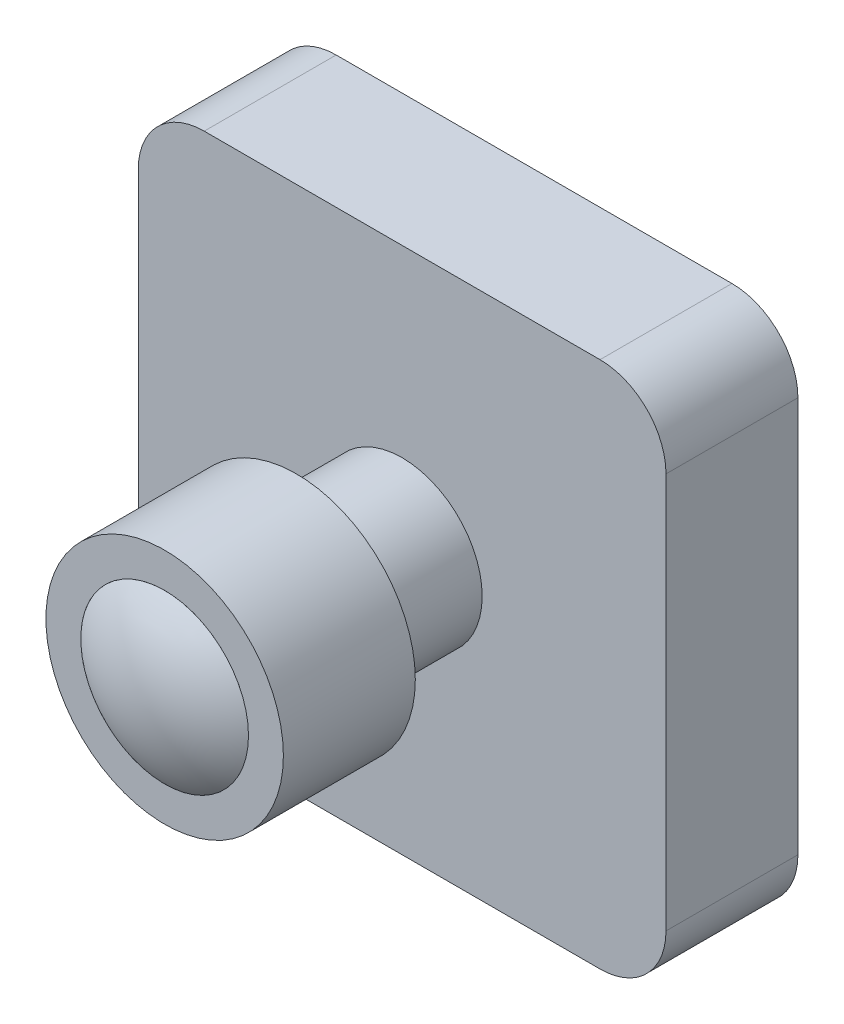
ISO-10303-21;
HEADER;
FILE_DESCRIPTION(('STEP AP214'),'2;1');
FILE_NAME('part.step','',(''),(''),'','','');
FILE_SCHEMA(('AUTOMOTIVE_DESIGN { 1 0 10303 214 1 1 1 1 }'));
ENDSEC;
DATA;
#1=APPLICATION_CONTEXT('core data for automotive mechanical design processes');
#2=APPLICATION_PROTOCOL_DEFINITION('international standard','automotive_design',2000,#1);
#3=PRODUCT_CONTEXT('',#1,'mechanical');
#4=PRODUCT('Part','Part','',(#3));
#5=PRODUCT_RELATED_PRODUCT_CATEGORY('part','',(#4));
#6=PRODUCT_DEFINITION_FORMATION('','',#4);
#7=PRODUCT_DEFINITION_CONTEXT('part definition',#1,'design');
#8=PRODUCT_DEFINITION('design','',#6,#7);
#9=PRODUCT_DEFINITION_SHAPE('','',#8);
#10=(LENGTH_UNIT() NAMED_UNIT(*) SI_UNIT(.MILLI.,.METRE.));
#11=(NAMED_UNIT(*) PLANE_ANGLE_UNIT() SI_UNIT($,.RADIAN.));
#12=(NAMED_UNIT(*) SI_UNIT($,.STERADIAN.) SOLID_ANGLE_UNIT());
#13=UNCERTAINTY_MEASURE_WITH_UNIT(LENGTH_MEASURE(1.E-05),#10,'distance_accuracy_value','');
#14=(GEOMETRIC_REPRESENTATION_CONTEXT(3) GLOBAL_UNCERTAINTY_ASSIGNED_CONTEXT((#13)) GLOBAL_UNIT_ASSIGNED_CONTEXT((#10,
#11,#12)) REPRESENTATION_CONTEXT('',''));
#15=CARTESIAN_POINT('',(0.,0.,0.));
#16=DIRECTION('',(0.,0.,1.));
#17=DIRECTION('',(1.,0.,0.));
#18=AXIS2_PLACEMENT_3D('',#15,#16,#17);
#19=CARTESIAN_POINT('',(0.,0.,1.32776193960538));
#20=DIRECTION('',(0.,0.,1.));
#21=DIRECTION('',(1.,0.,0.));
#22=AXIS2_PLACEMENT_3D('',#19,#20,#21);
#23=SPHERICAL_SURFACE('',#22,10.7514344350373);
#24=CARTESIAN_POINT('',(0.,0.,10.));
#25=DIRECTION('',(0.,0.,1.));
#26=DIRECTION('',(1.,0.,0.));
#27=AXIS2_PLACEMENT_3D('',#24,#25,#26);
#28=CIRCLE('',#27,6.35496887755949);
#29=CARTESIAN_POINT('',(6.35496887755949,0.,10.));
#30=VERTEX_POINT('',#29);
#31=EDGE_CURVE('E11',#30,#30,#28,.T.);
#32=ORIENTED_EDGE('',*,*,#31,.T.);
#33=EDGE_LOOP('',(#32));
#34=FACE_BOUND('',#33,.T.);
#35=ADVANCED_FACE('F46',(#34),#23,.T.);
#36=OPEN_SHELL('',(#35));
#37=SHELL_BASED_SURFACE_MODEL('B2',(#36));
#38=CARTESIAN_POINT('',(-15.,-15.,-18.));
#39=DIRECTION('',(0.,0.,1.));
#40=DIRECTION('',(1.,0.,0.));
#41=AXIS2_PLACEMENT_3D('',#38,#39,#40);
#42=CYLINDRICAL_SURFACE('',#41,5.);
#43=CARTESIAN_POINT('',(-15.,-15.,-8.));
#44=DIRECTION('',(0.,0.,-1.));
#45=DIRECTION('',(1.,0.,0.));
#46=AXIS2_PLACEMENT_3D('',#43,#44,#45);
#47=CIRCLE('',#46,5.);
#48=CARTESIAN_POINT('',(-15.,-20.,-8.));
#49=VERTEX_POINT('',#48);
#50=CARTESIAN_POINT('',(-20.,-15.,-8.));
#51=VERTEX_POINT('',#50);
#52=EDGE_CURVE('E166',#49,#51,#47,.T.);
#53=ORIENTED_EDGE('',*,*,#52,.T.);
#54=DIRECTION('',(0.,0.,1.));
#55=VECTOR('',#54,1.);
#56=CARTESIAN_POINT('',(-20.,-15.,-18.));
#57=LINE('',#56,#55);
#58=CARTESIAN_POINT('',(-20.,-15.,-18.));
#59=VERTEX_POINT('',#58);
#60=EDGE_CURVE('E44',#59,#51,#57,.T.);
#61=ORIENTED_EDGE('',*,*,#60,.F.);
#62=CARTESIAN_POINT('',(-15.,-15.,-18.));
#63=DIRECTION('',(0.,0.,-1.));
#64=DIRECTION('',(1.,0.,0.));
#65=AXIS2_PLACEMENT_3D('',#62,#63,#64);
#66=CIRCLE('',#65,5.);
#67=CARTESIAN_POINT('',(-15.,-20.,-18.));
#68=VERTEX_POINT('',#67);
#69=EDGE_CURVE('E180',#68,#59,#66,.T.);
#70=ORIENTED_EDGE('',*,*,#69,.F.);
#71=DIRECTION('',(0.,0.,1.));
#72=VECTOR('',#71,1.);
#73=CARTESIAN_POINT('',(-15.,-20.,-18.));
#74=LINE('',#73,#72);
#75=EDGE_CURVE('E162',#68,#49,#74,.T.);
#76=ORIENTED_EDGE('',*,*,#75,.T.);
#77=EDGE_LOOP('',(#53,#61,#70,#76));
#78=FACE_BOUND('',#77,.T.);
#79=ADVANCED_FACE('F70',(#78),#42,.T.);
#80=CARTESIAN_POINT('',(-20.,-15.,-18.));
#81=DIRECTION('',(1.,0.,0.));
#82=DIRECTION('',(0.,0.,-1.));
#83=AXIS2_PLACEMENT_3D('',#80,#81,#82);
#84=PLANE('',#83);
#85=DIRECTION('',(0.,1.,0.));
#86=VECTOR('',#85,1.);
#87=CARTESIAN_POINT('',(-20.,-15.,-8.));
#88=LINE('',#87,#86);
#89=CARTESIAN_POINT('',(-20.,15.,-8.));
#90=VERTEX_POINT('',#89);
#91=EDGE_CURVE('E169',#51,#90,#88,.T.);
#92=ORIENTED_EDGE('',*,*,#91,.T.);
#93=DIRECTION('',(0.,0.,1.));
#94=VECTOR('',#93,1.);
#95=CARTESIAN_POINT('',(-20.,15.,-18.));
#96=LINE('',#95,#94);
#97=CARTESIAN_POINT('',(-20.,15.,-18.));
#98=VERTEX_POINT('',#97);
#99=EDGE_CURVE('E78',#98,#90,#96,.T.);
#100=ORIENTED_EDGE('',*,*,#99,.F.);
#101=DIRECTION('',(0.,1.,0.));
#102=VECTOR('',#101,1.);
#103=CARTESIAN_POINT('',(-20.,-15.,-18.));
#104=LINE('',#103,#102);
#105=EDGE_CURVE('E129',#59,#98,#104,.T.);
#106=ORIENTED_EDGE('',*,*,#105,.F.);
#107=ORIENTED_EDGE('',*,*,#60,.T.);
#108=EDGE_LOOP('',(#92,#100,#106,#107));
#109=FACE_BOUND('',#108,.T.);
#110=ADVANCED_FACE('F215',(#109),#84,.F.);
#111=CARTESIAN_POINT('',(-15.,15.,-18.));
#112=DIRECTION('',(0.,0.,1.));
#113=DIRECTION('',(1.,0.,0.));
#114=AXIS2_PLACEMENT_3D('',#111,#112,#113);
#115=CYLINDRICAL_SURFACE('',#114,5.);
#116=CARTESIAN_POINT('',(-15.,15.,-8.));
#117=DIRECTION('',(0.,0.,-1.));
#118=DIRECTION('',(1.,0.,0.));
#119=AXIS2_PLACEMENT_3D('',#116,#117,#118);
#120=CIRCLE('',#119,5.);
#121=CARTESIAN_POINT('',(-15.,20.,-8.));
#122=VERTEX_POINT('',#121);
#123=EDGE_CURVE('E171',#90,#122,#120,.T.);
#124=ORIENTED_EDGE('',*,*,#123,.T.);
#125=DIRECTION('',(0.,0.,1.));
#126=VECTOR('',#125,1.);
#127=CARTESIAN_POINT('',(-15.,20.,-18.));
#128=LINE('',#127,#126);
#129=CARTESIAN_POINT('',(-15.,20.,-18.));
#130=VERTEX_POINT('',#129);
#131=EDGE_CURVE('E187',#130,#122,#128,.T.);
#132=ORIENTED_EDGE('',*,*,#131,.F.);
#133=CARTESIAN_POINT('',(-15.,15.,-18.));
#134=DIRECTION('',(0.,0.,-1.));
#135=DIRECTION('',(1.,0.,0.));
#136=AXIS2_PLACEMENT_3D('',#133,#134,#135);
#137=CIRCLE('',#136,5.);
#138=EDGE_CURVE('E195',#98,#130,#137,.T.);
#139=ORIENTED_EDGE('',*,*,#138,.F.);
#140=ORIENTED_EDGE('',*,*,#99,.T.);
#141=EDGE_LOOP('',(#124,#132,#139,#140));
#142=FACE_BOUND('',#141,.T.);
#143=ADVANCED_FACE('F193',(#142),#115,.T.);
#144=CARTESIAN_POINT('',(15.,20.,-18.));
#145=DIRECTION('',(0.,-1.,0.));
#146=DIRECTION('',(0.,0.,-1.));
#147=AXIS2_PLACEMENT_3D('',#144,#145,#146);
#148=PLANE('',#147);
#149=DIRECTION('',(1.,0.,0.));
#150=VECTOR('',#149,1.);
#151=CARTESIAN_POINT('',(15.,20.,-8.));
#152=LINE('',#151,#150);
#153=CARTESIAN_POINT('',(15.,20.,-8.));
#154=VERTEX_POINT('',#153);
#155=EDGE_CURVE('E173',#122,#154,#152,.T.);
#156=ORIENTED_EDGE('',*,*,#155,.T.);
#157=DIRECTION('',(0.,0.,1.));
#158=VECTOR('',#157,1.);
#159=CARTESIAN_POINT('',(15.,20.,-18.));
#160=LINE('',#159,#158);
#161=CARTESIAN_POINT('',(15.,20.,-18.));
#162=VERTEX_POINT('',#161);
#163=EDGE_CURVE('E184',#162,#154,#160,.T.);
#164=ORIENTED_EDGE('',*,*,#163,.F.);
#165=DIRECTION('',(1.,0.,0.));
#166=VECTOR('',#165,1.);
#167=CARTESIAN_POINT('',(15.,20.,-18.));
#168=LINE('',#167,#166);
#169=EDGE_CURVE('E207',#130,#162,#168,.T.);
#170=ORIENTED_EDGE('',*,*,#169,.F.);
#171=ORIENTED_EDGE('',*,*,#131,.T.);
#172=EDGE_LOOP('',(#156,#164,#170,#171));
#173=FACE_BOUND('',#172,.T.);
#174=ADVANCED_FACE('F203',(#173),#148,.F.);
#175=CARTESIAN_POINT('',(15.,15.,-18.));
#176=DIRECTION('',(0.,0.,1.));
#177=DIRECTION('',(1.,0.,0.));
#178=AXIS2_PLACEMENT_3D('',#175,#176,#177);
#179=CYLINDRICAL_SURFACE('',#178,5.);
#180=CARTESIAN_POINT('',(15.,15.,-8.));
#181=DIRECTION('',(0.,0.,-1.));
#182=DIRECTION('',(1.,0.,0.));
#183=AXIS2_PLACEMENT_3D('',#180,#181,#182);
#184=CIRCLE('',#183,5.);
#185=CARTESIAN_POINT('',(20.,15.,-8.));
#186=VERTEX_POINT('',#185);
#187=EDGE_CURVE('E175',#154,#186,#184,.T.);
#188=ORIENTED_EDGE('',*,*,#187,.T.);
#189=DIRECTION('',(0.,0.,1.));
#190=VECTOR('',#189,1.);
#191=CARTESIAN_POINT('',(20.,15.,-18.));
#192=LINE('',#191,#190);
#193=CARTESIAN_POINT('',(20.,15.,-18.));
#194=VERTEX_POINT('',#193);
#195=EDGE_CURVE('E157',#194,#186,#192,.T.);
#196=ORIENTED_EDGE('',*,*,#195,.F.);
#197=CARTESIAN_POINT('',(15.,15.,-18.));
#198=DIRECTION('',(0.,0.,-1.));
#199=DIRECTION('',(1.,0.,0.));
#200=AXIS2_PLACEMENT_3D('',#197,#198,#199);
#201=CIRCLE('',#200,5.);
#202=EDGE_CURVE('E148',#162,#194,#201,.T.);
#203=ORIENTED_EDGE('',*,*,#202,.F.);
#204=ORIENTED_EDGE('',*,*,#163,.T.);
#205=EDGE_LOOP('',(#188,#196,#203,#204));
#206=FACE_BOUND('',#205,.T.);
#207=ADVANCED_FACE('F206',(#206),#179,.T.);
#208=CARTESIAN_POINT('',(20.,-15.,-18.));
#209=DIRECTION('',(-1.,0.,0.));
#210=DIRECTION('',(0.,0.,1.));
#211=AXIS2_PLACEMENT_3D('',#208,#209,#210);
#212=PLANE('',#211);
#213=DIRECTION('',(0.,-1.,0.));
#214=VECTOR('',#213,1.);
#215=CARTESIAN_POINT('',(20.,-15.,-8.));
#216=LINE('',#215,#214);
#217=CARTESIAN_POINT('',(20.,-15.,-8.));
#218=VERTEX_POINT('',#217);
#219=EDGE_CURVE('E156',#186,#218,#216,.T.);
#220=ORIENTED_EDGE('',*,*,#219,.T.);
#221=DIRECTION('',(0.,0.,1.));
#222=VECTOR('',#221,1.);
#223=CARTESIAN_POINT('',(20.,-15.,-18.));
#224=LINE('',#223,#222);
#225=CARTESIAN_POINT('',(20.,-15.,-18.));
#226=VERTEX_POINT('',#225);
#227=EDGE_CURVE('E153',#226,#218,#224,.T.);
#228=ORIENTED_EDGE('',*,*,#227,.F.);
#229=DIRECTION('',(0.,-1.,0.));
#230=VECTOR('',#229,1.);
#231=CARTESIAN_POINT('',(20.,-15.,-18.));
#232=LINE('',#231,#230);
#233=EDGE_CURVE('E142',#194,#226,#232,.T.);
#234=ORIENTED_EDGE('',*,*,#233,.F.);
#235=ORIENTED_EDGE('',*,*,#195,.T.);
#236=EDGE_LOOP('',(#220,#228,#234,#235));
#237=FACE_BOUND('',#236,.T.);
#238=ADVANCED_FACE('F154',(#237),#212,.F.);
#239=CARTESIAN_POINT('',(15.,-15.,-18.));
#240=DIRECTION('',(0.,0.,1.));
#241=DIRECTION('',(1.,0.,0.));
#242=AXIS2_PLACEMENT_3D('',#239,#240,#241);
#243=CYLINDRICAL_SURFACE('',#242,5.);
#244=CARTESIAN_POINT('',(15.,-15.,-8.));
#245=DIRECTION('',(0.,0.,-1.));
#246=DIRECTION('',(1.,0.,0.));
#247=AXIS2_PLACEMENT_3D('',#244,#245,#246);
#248=CIRCLE('',#247,5.);
#249=CARTESIAN_POINT('',(15.,-20.,-8.));
#250=VERTEX_POINT('',#249);
#251=EDGE_CURVE('E115',#218,#250,#248,.T.);
#252=ORIENTED_EDGE('',*,*,#251,.T.);
#253=DIRECTION('',(0.,0.,1.));
#254=VECTOR('',#253,1.);
#255=CARTESIAN_POINT('',(15.,-20.,-18.));
#256=LINE('',#255,#254);
#257=CARTESIAN_POINT('',(15.,-20.,-18.));
#258=VERTEX_POINT('',#257);
#259=EDGE_CURVE('E158',#258,#250,#256,.T.);
#260=ORIENTED_EDGE('',*,*,#259,.F.);
#261=CARTESIAN_POINT('',(15.,-15.,-18.));
#262=DIRECTION('',(0.,0.,-1.));
#263=DIRECTION('',(1.,0.,0.));
#264=AXIS2_PLACEMENT_3D('',#261,#262,#263);
#265=CIRCLE('',#264,5.);
#266=EDGE_CURVE('E146',#226,#258,#265,.T.);
#267=ORIENTED_EDGE('',*,*,#266,.F.);
#268=ORIENTED_EDGE('',*,*,#227,.T.);
#269=EDGE_LOOP('',(#252,#260,#267,#268));
#270=FACE_BOUND('',#269,.T.);
#271=ADVANCED_FACE('F160',(#270),#243,.T.);
#272=CARTESIAN_POINT('',(15.,-20.,-18.));
#273=DIRECTION('',(0.,1.,0.));
#274=DIRECTION('',(0.,0.,1.));
#275=AXIS2_PLACEMENT_3D('',#272,#273,#274);
#276=PLANE('',#275);
#277=DIRECTION('',(-1.,0.,0.));
#278=VECTOR('',#277,1.);
#279=CARTESIAN_POINT('',(15.,-20.,-8.));
#280=LINE('',#279,#278);
#281=EDGE_CURVE('E121',#250,#49,#280,.T.);
#282=ORIENTED_EDGE('',*,*,#281,.T.);
#283=ORIENTED_EDGE('',*,*,#75,.F.);
#284=DIRECTION('',(-1.,0.,0.));
#285=VECTOR('',#284,1.);
#286=CARTESIAN_POINT('',(15.,-20.,-18.));
#287=LINE('',#286,#285);
#288=EDGE_CURVE('E86',#258,#68,#287,.T.);
#289=ORIENTED_EDGE('',*,*,#288,.F.);
#290=ORIENTED_EDGE('',*,*,#259,.T.);
#291=EDGE_LOOP('',(#282,#283,#289,#290));
#292=FACE_BOUND('',#291,.T.);
#293=ADVANCED_FACE('F231',(#292),#276,.F.);
#294=CARTESIAN_POINT('',(-15.,-15.,-18.));
#295=DIRECTION('',(0.,0.,1.));
#296=DIRECTION('',(1.,0.,0.));
#297=AXIS2_PLACEMENT_3D('',#294,#295,#296);
#298=PLANE('',#297);
#299=ORIENTED_EDGE('',*,*,#69,.T.);
#300=ORIENTED_EDGE('',*,*,#105,.T.);
#301=ORIENTED_EDGE('',*,*,#138,.T.);
#302=ORIENTED_EDGE('',*,*,#169,.T.);
#303=ORIENTED_EDGE('',*,*,#202,.T.);
#304=ORIENTED_EDGE('',*,*,#233,.T.);
#305=ORIENTED_EDGE('',*,*,#266,.T.);
#306=ORIENTED_EDGE('',*,*,#288,.T.);
#307=EDGE_LOOP('',(#299,#300,#301,#302,#303,#304,#305,#306));
#308=FACE_BOUND('',#307,.T.);
#309=ADVANCED_FACE('F144',(#308),#298,.F.);
#310=CARTESIAN_POINT('',(-15.,-15.,-8.));
#311=DIRECTION('',(0.,0.,1.));
#312=DIRECTION('',(1.,0.,0.));
#313=AXIS2_PLACEMENT_3D('',#310,#311,#312);
#314=PLANE('',#313);
#315=ORIENTED_EDGE('',*,*,#52,.F.);
#316=ORIENTED_EDGE('',*,*,#281,.F.);
#317=ORIENTED_EDGE('',*,*,#251,.F.);
#318=ORIENTED_EDGE('',*,*,#219,.F.);
#319=ORIENTED_EDGE('',*,*,#187,.F.);
#320=ORIENTED_EDGE('',*,*,#155,.F.);
#321=ORIENTED_EDGE('',*,*,#123,.F.);
#322=ORIENTED_EDGE('',*,*,#91,.F.);
#323=EDGE_LOOP('',(#315,#316,#317,#318,#319,#320,#321,#322));
#324=FACE_BOUND('',#323,.T.);
#325=ADVANCED_FACE('F199',(#324),#314,.T.);
#326=CLOSED_SHELL('',(#79,#110,#143,#174,#207,#238,#271,#293,#309,#325));
#327=MANIFOLD_SOLID_BREP('B6',#326);
#328=CARTESIAN_POINT('',(0.,0.,0.));
#329=DIRECTION('',(0.,0.,1.));
#330=DIRECTION('',(1.,0.,0.));
#331=AXIS2_PLACEMENT_3D('',#328,#329,#330);
#332=PLANE('',#331);
#333=CARTESIAN_POINT('',(0.,0.,0.));
#334=DIRECTION('',(0.,0.,1.));
#335=DIRECTION('',(1.,0.,0.));
#336=AXIS2_PLACEMENT_3D('',#333,#334,#335);
#337=CIRCLE('',#336,9.);
#338=CARTESIAN_POINT('',(9.,0.,0.));
#339=VERTEX_POINT('',#338);
#340=EDGE_CURVE('E314',#339,#339,#337,.T.);
#341=ORIENTED_EDGE('',*,*,#340,.F.);
#342=EDGE_LOOP('',(#341));
#343=FACE_BOUND('',#342,.T.);
#344=CARTESIAN_POINT('',(0.,0.,0.));
#345=DIRECTION('',(0.,0.,1.));
#346=DIRECTION('',(1.,0.,0.));
#347=AXIS2_PLACEMENT_3D('',#344,#345,#346);
#348=CIRCLE('',#347,6.06688216082649);
#349=CARTESIAN_POINT('',(6.06688216082649,0.,0.));
#350=VERTEX_POINT('',#349);
#351=EDGE_CURVE('E69',#350,#350,#348,.F.);
#352=ORIENTED_EDGE('',*,*,#351,.F.);
#353=EDGE_LOOP('',(#352));
#354=FACE_BOUND('',#353,.T.);
#355=ADVANCED_FACE('F298',(#343,#354),#332,.F.);
#356=CARTESIAN_POINT('',(0.,0.,10.));
#357=DIRECTION('',(0.,0.,1.));
#358=DIRECTION('',(1.,0.,0.));
#359=AXIS2_PLACEMENT_3D('',#356,#357,#358);
#360=CONICAL_SURFACE('',#359,6.35496887755949,0.381452367895648);
#361=CARTESIAN_POINT('',(0.,0.,10.));
#362=DIRECTION('',(0.,0.,-1.));
#363=DIRECTION('',(-1.,0.,0.));
#364=AXIS2_PLACEMENT_3D('',#361,#362,#363);
#365=CIRCLE('',#364,6.35496887755949);
#366=CARTESIAN_POINT('',(-6.35496887755949,0.,10.));
#367=VERTEX_POINT('',#366);
#368=EDGE_CURVE('E319',#367,#367,#365,.T.);
#369=ORIENTED_EDGE('',*,*,#368,.F.);
#370=EDGE_LOOP('',(#369));
#371=FACE_BOUND('',#370,.T.);
#372=CARTESIAN_POINT('',(0.,0.,4.28162061831282));
#373=DIRECTION('',(0.,0.,1.));
#374=DIRECTION('',(1.,0.,0.));
#375=AXIS2_PLACEMENT_3D('',#372,#373,#374);
#376=CIRCLE('',#375,4.06133968799222);
#377=CARTESIAN_POINT('',(4.06133968799222,0.,4.28162061831282));
#378=VERTEX_POINT('',#377);
#379=EDGE_CURVE('E317',#378,#378,#376,.F.);
#380=ORIENTED_EDGE('',*,*,#379,.T.);
#381=EDGE_LOOP('',(#380));
#382=FACE_BOUND('',#381,.T.);
#383=ADVANCED_FACE('F353',(#371,#382),#360,.F.);
#384=CARTESIAN_POINT('',(0.,0.,10.));
#385=DIRECTION('',(0.,0.,1.));
#386=DIRECTION('',(1.,0.,0.));
#387=AXIS2_PLACEMENT_3D('',#384,#385,#386);
#388=PLANE('',#387);
#389=CARTESIAN_POINT('',(0.,0.,10.));
#390=DIRECTION('',(0.,0.,1.));
#391=DIRECTION('',(1.,0.,0.));
#392=AXIS2_PLACEMENT_3D('',#389,#390,#391);
#393=CIRCLE('',#392,9.);
#394=CARTESIAN_POINT('',(9.,0.,10.));
#395=VERTEX_POINT('',#394);
#396=EDGE_CURVE('E309',#395,#395,#393,.T.);
#397=ORIENTED_EDGE('',*,*,#396,.T.);
#398=EDGE_LOOP('',(#397));
#399=FACE_BOUND('',#398,.T.);
#400=ORIENTED_EDGE('',*,*,#368,.T.);
#401=EDGE_LOOP('',(#400));
#402=FACE_BOUND('',#401,.T.);
#403=ADVANCED_FACE('F358',(#399,#402),#388,.T.);
#404=CARTESIAN_POINT('',(0.,0.,10.));
#405=DIRECTION('',(0.,0.,-1.));
#406=DIRECTION('',(-1.,0.,0.));
#407=AXIS2_PLACEMENT_3D('',#404,#405,#406);
#408=CYLINDRICAL_SURFACE('',#407,9.);
#409=ORIENTED_EDGE('',*,*,#396,.F.);
#410=EDGE_LOOP('',(#409));
#411=FACE_BOUND('',#410,.T.);
#412=ORIENTED_EDGE('',*,*,#340,.T.);
#413=EDGE_LOOP('',(#412));
#414=FACE_BOUND('',#413,.T.);
#415=ADVANCED_FACE('F300',(#411,#414),#408,.T.);
#416=CARTESIAN_POINT('',(0.,0.,4.6876436639327));
#417=DIRECTION('',(0.,0.,1.));
#418=DIRECTION('',(1.,0.,0.));
#419=AXIS2_PLACEMENT_3D('',#416,#417,#418);
#420=PLANE('',#419);
#421=CARTESIAN_POINT('',(0.,0.,4.6876436639327));
#422=DIRECTION('',(0.,0.,1.));
#423=DIRECTION('',(1.,0.,0.));
#424=AXIS2_PLACEMENT_3D('',#421,#422,#423);
#425=CIRCLE('',#424,4.06133968799222);
#426=CARTESIAN_POINT('',(4.06133968799222,0.,4.6876436639327));
#427=VERTEX_POINT('',#426);
#428=EDGE_CURVE('E320',#427,#427,#425,.T.);
#429=ORIENTED_EDGE('',*,*,#428,.T.);
#430=EDGE_LOOP('',(#429));
#431=FACE_BOUND('',#430,.T.);
#432=CARTESIAN_POINT('',(0.,0.,4.6876436639327));
#433=DIRECTION('',(0.,0.,1.));
#434=DIRECTION('',(1.,0.,0.));
#435=AXIS2_PLACEMENT_3D('',#432,#433,#434);
#436=CIRCLE('',#435,2.03443886662841);
#437=CARTESIAN_POINT('',(2.03443886662841,0.,4.6876436639327));
#438=VERTEX_POINT('',#437);
#439=EDGE_CURVE('E326',#438,#438,#436,.T.);
#440=ORIENTED_EDGE('',*,*,#439,.F.);
#441=EDGE_LOOP('',(#440));
#442=FACE_BOUND('',#441,.T.);
#443=ADVANCED_FACE('F370',(#431,#442),#420,.T.);
#444=CARTESIAN_POINT('',(0.,0.,4.6876436639327));
#445=DIRECTION('',(0.,0.,-1.));
#446=DIRECTION('',(-1.,0.,0.));
#447=AXIS2_PLACEMENT_3D('',#444,#445,#446);
#448=CYLINDRICAL_SURFACE('',#447,4.06133968799222);
#449=ORIENTED_EDGE('',*,*,#379,.F.);
#450=EDGE_LOOP('',(#449));
#451=FACE_BOUND('',#450,.T.);
#452=ORIENTED_EDGE('',*,*,#428,.F.);
#453=EDGE_LOOP('',(#452));
#454=FACE_BOUND('',#453,.T.);
#455=ADVANCED_FACE('F367',(#451,#454),#448,.T.);
#456=CARTESIAN_POINT('',(0.,0.,4.6876436639327));
#457=DIRECTION('',(0.,0.,-1.));
#458=DIRECTION('',(-1.,0.,0.));
#459=AXIS2_PLACEMENT_3D('',#456,#457,#458);
#460=CYLINDRICAL_SURFACE('',#459,2.03443886662841);
#461=ORIENTED_EDGE('',*,*,#439,.T.);
#462=EDGE_LOOP('',(#461));
#463=FACE_BOUND('',#462,.T.);
#464=CARTESIAN_POINT('',(0.,0.,2.6876436639327));
#465=DIRECTION('',(0.,0.,1.));
#466=DIRECTION('',(1.,0.,0.));
#467=AXIS2_PLACEMENT_3D('',#464,#465,#466);
#468=CIRCLE('',#467,2.03443886662841);
#469=CARTESIAN_POINT('',(2.03443886662841,0.,2.6876436639327));
#470=VERTEX_POINT('',#469);
#471=EDGE_CURVE('E305',#470,#470,#468,.F.);
#472=ORIENTED_EDGE('',*,*,#471,.T.);
#473=EDGE_LOOP('',(#472));
#474=FACE_BOUND('',#473,.T.);
#475=ADVANCED_FACE('F348',(#463,#474),#460,.F.);
#476=CARTESIAN_POINT('',(0.,0.,2.6876436639327));
#477=DIRECTION('',(0.,0.,1.));
#478=DIRECTION('',(1.,0.,0.));
#479=AXIS2_PLACEMENT_3D('',#476,#477,#478);
#480=PLANE('',#479);
#481=ORIENTED_EDGE('',*,*,#471,.F.);
#482=EDGE_LOOP('',(#481));
#483=FACE_BOUND('',#482,.T.);
#484=ADVANCED_FACE('F341',(#483),#480,.T.);
#485=CARTESIAN_POINT('',(0.,0.,-8.));
#486=DIRECTION('',(0.,0.,1.));
#487=DIRECTION('',(1.,0.,0.));
#488=AXIS2_PLACEMENT_3D('',#485,#486,#487);
#489=CYLINDRICAL_SURFACE('',#488,6.06688216082649);
#490=CARTESIAN_POINT('',(0.,0.,-8.));
#491=DIRECTION('',(0.,0.,-1.));
#492=DIRECTION('',(-1.,0.,0.));
#493=AXIS2_PLACEMENT_3D('',#490,#491,#492);
#494=CIRCLE('',#493,6.06688216082649);
#495=CARTESIAN_POINT('',(-6.06688216082649,0.,-8.));
#496=VERTEX_POINT('',#495);
#497=EDGE_CURVE('E331',#496,#496,#494,.T.);
#498=ORIENTED_EDGE('',*,*,#497,.F.);
#499=EDGE_LOOP('',(#498));
#500=FACE_BOUND('',#499,.T.);
#501=ORIENTED_EDGE('',*,*,#351,.T.);
#502=EDGE_LOOP('',(#501));
#503=FACE_BOUND('',#502,.T.);
#504=ADVANCED_FACE('F339',(#500,#503),#489,.T.);
#505=CARTESIAN_POINT('',(0.,0.,-8.));
#506=DIRECTION('',(0.,0.,-1.));
#507=DIRECTION('',(-1.,0.,0.));
#508=AXIS2_PLACEMENT_3D('',#505,#506,#507);
#509=PLANE('',#508);
#510=ORIENTED_EDGE('',*,*,#497,.T.);
#511=EDGE_LOOP('',(#510));
#512=FACE_BOUND('',#511,.T.);
#513=ADVANCED_FACE('F337',(#512),#509,.T.);
#514=CLOSED_SHELL('',(#355,#383,#403,#415,#443,#455,#475,#484,#504,#513));
#515=MANIFOLD_SOLID_BREP('B38',#514);
#516=ADVANCED_BREP_SHAPE_REPRESENTATION('',(#18,#327,#515),#14);
#517=MANIFOLD_SURFACE_SHAPE_REPRESENTATION('',(#18,#37),#14);
#518=SHAPE_REPRESENTATION('',(#18),#14);
#519=SHAPE_DEFINITION_REPRESENTATION(#9,#518);
#520=SHAPE_REPRESENTATION_RELATIONSHIP('','',#518,#516);
#521=SHAPE_REPRESENTATION_RELATIONSHIP('','',#518,#517);
ENDSEC;
END-ISO-10303-21;
